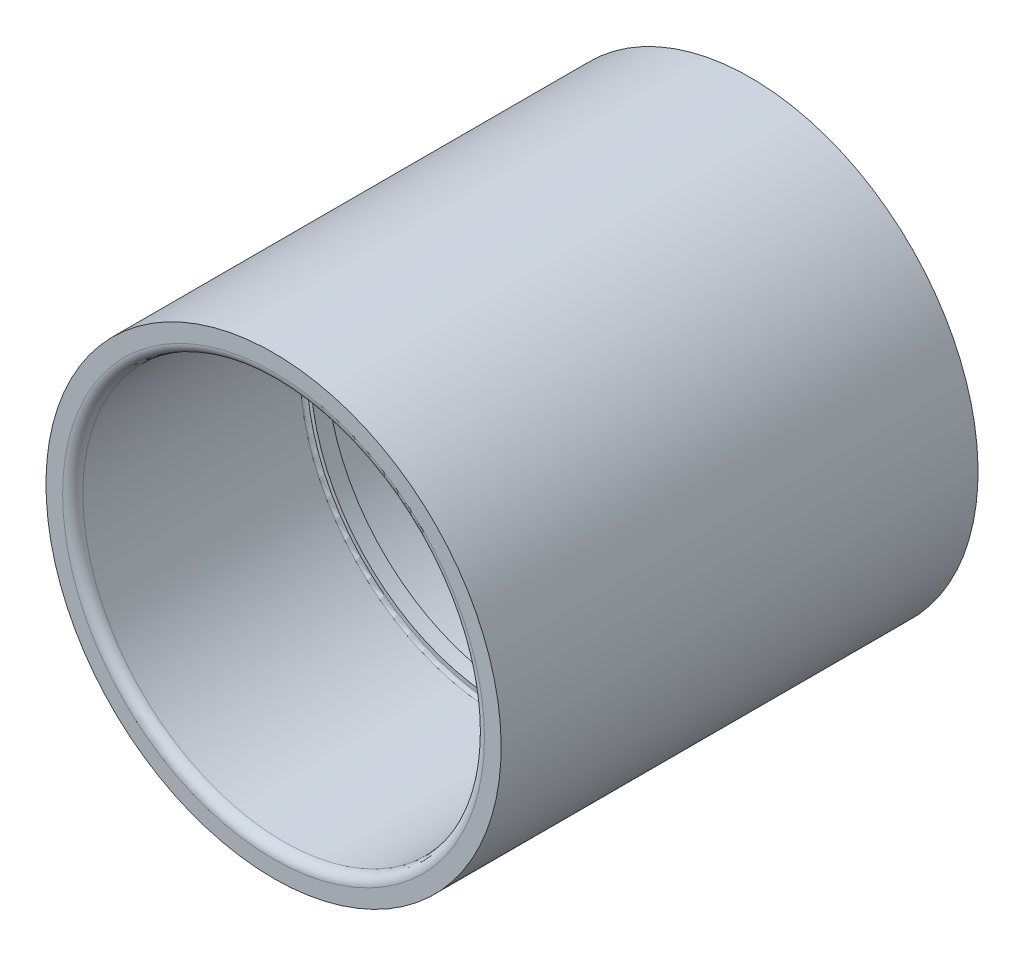
ISO-10303-21;
HEADER;
FILE_DESCRIPTION(('STEP AP214'),'2;1');
FILE_NAME('part.step','',(''),(''),'','','');
FILE_SCHEMA(('AUTOMOTIVE_DESIGN { 1 0 10303 214 1 1 1 1 }'));
ENDSEC;
DATA;
#1=APPLICATION_CONTEXT('core data for automotive mechanical design processes');
#2=APPLICATION_PROTOCOL_DEFINITION('international standard','automotive_design',2000,#1);
#3=PRODUCT_CONTEXT('',#1,'mechanical');
#4=PRODUCT('Part','Part','',(#3));
#5=PRODUCT_RELATED_PRODUCT_CATEGORY('part','',(#4));
#6=PRODUCT_DEFINITION_FORMATION('','',#4);
#7=PRODUCT_DEFINITION_CONTEXT('part definition',#1,'design');
#8=PRODUCT_DEFINITION('design','',#6,#7);
#9=PRODUCT_DEFINITION_SHAPE('','',#8);
#10=(LENGTH_UNIT() NAMED_UNIT(*) SI_UNIT(.MILLI.,.METRE.));
#11=(NAMED_UNIT(*) PLANE_ANGLE_UNIT() SI_UNIT($,.RADIAN.));
#12=(NAMED_UNIT(*) SI_UNIT($,.STERADIAN.) SOLID_ANGLE_UNIT());
#13=UNCERTAINTY_MEASURE_WITH_UNIT(LENGTH_MEASURE(1.E-05),#10,'distance_accuracy_value','');
#14=(GEOMETRIC_REPRESENTATION_CONTEXT(3) GLOBAL_UNCERTAINTY_ASSIGNED_CONTEXT((#13)) GLOBAL_UNIT_ASSIGNED_CONTEXT((#10,
#11,#12)) REPRESENTATION_CONTEXT('',''));
#15=CARTESIAN_POINT('',(0.,0.,0.));
#16=DIRECTION('',(0.,0.,1.));
#17=DIRECTION('',(1.,0.,0.));
#18=AXIS2_PLACEMENT_3D('',#15,#16,#17);
#19=CARTESIAN_POINT('',(0.,-34.3535,35.9918));
#20=DIRECTION('',(0.,0.,1.));
#21=DIRECTION('',(0.,-1.,0.));
#22=AXIS2_PLACEMENT_3D('',#19,#20,#21);
#23=PLANE('',#22);
#24=CARTESIAN_POINT('',(0.,0.,35.9918));
#25=DIRECTION('',(0.,0.,1.));
#26=DIRECTION('',(0.,-1.,0.));
#27=AXIS2_PLACEMENT_3D('',#24,#25,#26);
#28=CIRCLE('',#27,31.8389);
#29=CARTESIAN_POINT('',(0.,-31.8389,35.9918));
#30=VERTEX_POINT('',#29);
#31=EDGE_CURVE('E50',#30,#30,#28,.F.);
#32=ORIENTED_EDGE('',*,*,#31,.T.);
#33=EDGE_LOOP('',(#32));
#34=FACE_BOUND('',#33,.T.);
#35=CARTESIAN_POINT('',(0.,0.,35.9918));
#36=DIRECTION('',(0.,0.,1.));
#37=DIRECTION('',(0.,-1.,0.));
#38=AXIS2_PLACEMENT_3D('',#35,#36,#37);
#39=CIRCLE('',#38,34.3535);
#40=CARTESIAN_POINT('',(0.,-34.3535,35.9918));
#41=VERTEX_POINT('',#40);
#42=EDGE_CURVE('E71',#41,#41,#39,.T.);
#43=ORIENTED_EDGE('',*,*,#42,.T.);
#44=EDGE_LOOP('',(#43));
#45=FACE_BOUND('',#44,.T.);
#46=ADVANCED_FACE('F30',(#34,#45),#23,.T.);
#47=CARTESIAN_POINT('',(0.,0.,35.9918));
#48=DIRECTION('',(0.,0.,1.));
#49=DIRECTION('',(0.,-1.,0.));
#50=AXIS2_PLACEMENT_3D('',#47,#48,#49);
#51=CYLINDRICAL_SURFACE('',#50,30.3149);
#52=CARTESIAN_POINT('',(0.,0.,1.70180000000001));
#53=DIRECTION('',(0.,0.,1.));
#54=DIRECTION('',(0.,-1.,0.));
#55=AXIS2_PLACEMENT_3D('',#52,#53,#54);
#56=CIRCLE('',#55,30.3149);
#57=CARTESIAN_POINT('',(0.,-30.3149,1.7018));
#58=VERTEX_POINT('',#57);
#59=EDGE_CURVE('E10',#58,#58,#56,.F.);
#60=ORIENTED_EDGE('',*,*,#59,.T.);
#61=EDGE_LOOP('',(#60));
#62=FACE_BOUND('',#61,.T.);
#63=CARTESIAN_POINT('',(0.,0.,34.4678));
#64=DIRECTION('',(0.,0.,1.));
#65=DIRECTION('',(0.,-1.,0.));
#66=AXIS2_PLACEMENT_3D('',#63,#64,#65);
#67=CIRCLE('',#66,30.3149);
#68=CARTESIAN_POINT('',(0.,-30.3149,34.4678));
#69=VERTEX_POINT('',#68);
#70=EDGE_CURVE('E53',#69,#69,#67,.T.);
#71=ORIENTED_EDGE('',*,*,#70,.T.);
#72=EDGE_LOOP('',(#71));
#73=FACE_BOUND('',#72,.T.);
#74=ADVANCED_FACE('F93',(#62,#73),#51,.F.);
#75=CARTESIAN_POINT('',(0.,-30.3149,1.1938));
#76=DIRECTION('',(0.,0.,1.));
#77=DIRECTION('',(0.,-1.,0.));
#78=AXIS2_PLACEMENT_3D('',#75,#76,#77);
#79=PLANE('',#78);
#80=CARTESIAN_POINT('',(0.,0.,1.19380000000001));
#81=DIRECTION('',(0.,0.,1.));
#82=DIRECTION('',(0.,-1.,0.));
#83=AXIS2_PLACEMENT_3D('',#80,#81,#82);
#84=CIRCLE('',#83,29.8069);
#85=CARTESIAN_POINT('',(0.,-29.8069,1.1938));
#86=VERTEX_POINT('',#85);
#87=EDGE_CURVE('E37',#86,#86,#84,.T.);
#88=ORIENTED_EDGE('',*,*,#87,.T.);
#89=EDGE_LOOP('',(#88));
#90=FACE_BOUND('',#89,.T.);
#91=CARTESIAN_POINT('',(0.,0.,1.19380000000001));
#92=DIRECTION('',(0.,0.,1.));
#93=DIRECTION('',(0.,-1.,0.));
#94=AXIS2_PLACEMENT_3D('',#91,#92,#93);
#95=CIRCLE('',#94,29.1973);
#96=CARTESIAN_POINT('',(0.,-29.1973,1.1938));
#97=VERTEX_POINT('',#96);
#98=EDGE_CURVE('E62',#97,#97,#95,.T.);
#99=ORIENTED_EDGE('',*,*,#98,.F.);
#100=EDGE_LOOP('',(#99));
#101=FACE_BOUND('',#100,.T.);
#102=ADVANCED_FACE('F99',(#90,#101),#79,.T.);
#103=CARTESIAN_POINT('',(0.,0.,35.9918));
#104=DIRECTION('',(0.,0.,1.));
#105=DIRECTION('',(0.,-1.,0.));
#106=AXIS2_PLACEMENT_3D('',#103,#104,#105);
#107=CYLINDRICAL_SURFACE('',#106,29.1973);
#108=ORIENTED_EDGE('',*,*,#98,.T.);
#109=EDGE_LOOP('',(#108));
#110=FACE_BOUND('',#109,.T.);
#111=CARTESIAN_POINT('',(0.,0.,-1.19379999999999));
#112=DIRECTION('',(0.,0.,1.));
#113=DIRECTION('',(0.,-1.,0.));
#114=AXIS2_PLACEMENT_3D('',#111,#112,#113);
#115=CIRCLE('',#114,29.1973);
#116=CARTESIAN_POINT('',(0.,-29.1973,-1.1938));
#117=VERTEX_POINT('',#116);
#118=EDGE_CURVE('E65',#117,#117,#115,.T.);
#119=ORIENTED_EDGE('',*,*,#118,.F.);
#120=EDGE_LOOP('',(#119));
#121=FACE_BOUND('',#120,.T.);
#122=ADVANCED_FACE('F128',(#110,#121),#107,.F.);
#123=CARTESIAN_POINT('',(0.,-30.3149,-1.1938));
#124=DIRECTION('',(0.,0.,-1.));
#125=DIRECTION('',(0.,1.,0.));
#126=AXIS2_PLACEMENT_3D('',#123,#124,#125);
#127=PLANE('',#126);
#128=CARTESIAN_POINT('',(0.,0.,-1.19379999999999));
#129=DIRECTION('',(0.,0.,-1.));
#130=DIRECTION('',(0.,1.,0.));
#131=AXIS2_PLACEMENT_3D('',#128,#129,#130);
#132=CIRCLE('',#131,29.8069);
#133=CARTESIAN_POINT('',(0.,29.8069,-1.19379999999999));
#134=VERTEX_POINT('',#133);
#135=EDGE_CURVE('E41',#134,#134,#132,.T.);
#136=ORIENTED_EDGE('',*,*,#135,.T.);
#137=EDGE_LOOP('',(#136));
#138=FACE_BOUND('',#137,.T.);
#139=ORIENTED_EDGE('',*,*,#118,.T.);
#140=EDGE_LOOP('',(#139));
#141=FACE_BOUND('',#140,.T.);
#142=ADVANCED_FACE('F118',(#138,#141),#127,.T.);
#143=CARTESIAN_POINT('',(0.,0.,35.9918));
#144=DIRECTION('',(0.,0.,1.));
#145=DIRECTION('',(0.,-1.,0.));
#146=AXIS2_PLACEMENT_3D('',#143,#144,#145);
#147=CYLINDRICAL_SURFACE('',#146,30.3149);
#148=CARTESIAN_POINT('',(0.,0.,-1.7018));
#149=DIRECTION('',(0.,0.,-1.));
#150=DIRECTION('',(0.,1.,0.));
#151=AXIS2_PLACEMENT_3D('',#148,#149,#150);
#152=CIRCLE('',#151,30.3149);
#153=CARTESIAN_POINT('',(0.,30.3149,-1.70179999999999));
#154=VERTEX_POINT('',#153);
#155=EDGE_CURVE('E45',#154,#154,#152,.F.);
#156=ORIENTED_EDGE('',*,*,#155,.T.);
#157=EDGE_LOOP('',(#156));
#158=FACE_BOUND('',#157,.T.);
#159=CARTESIAN_POINT('',(0.,0.,-34.4678));
#160=DIRECTION('',(0.,0.,-1.));
#161=DIRECTION('',(0.,1.,0.));
#162=AXIS2_PLACEMENT_3D('',#159,#160,#161);
#163=CIRCLE('',#162,30.3149);
#164=CARTESIAN_POINT('',(0.,30.3149,-34.4678));
#165=VERTEX_POINT('',#164);
#166=EDGE_CURVE('E56',#165,#165,#163,.T.);
#167=ORIENTED_EDGE('',*,*,#166,.T.);
#168=EDGE_LOOP('',(#167));
#169=FACE_BOUND('',#168,.T.);
#170=ADVANCED_FACE('F89',(#158,#169),#147,.F.);
#171=CARTESIAN_POINT('',(0.,-34.3535,-35.9918));
#172=DIRECTION('',(0.,0.,-1.));
#173=DIRECTION('',(0.,1.,0.));
#174=AXIS2_PLACEMENT_3D('',#171,#172,#173);
#175=PLANE('',#174);
#176=CARTESIAN_POINT('',(0.,0.,-35.9918));
#177=DIRECTION('',(0.,0.,-1.));
#178=DIRECTION('',(0.,1.,0.));
#179=AXIS2_PLACEMENT_3D('',#176,#177,#178);
#180=CIRCLE('',#179,31.8389);
#181=CARTESIAN_POINT('',(0.,31.8389,-35.9918));
#182=VERTEX_POINT('',#181);
#183=EDGE_CURVE('E59',#182,#182,#180,.F.);
#184=ORIENTED_EDGE('',*,*,#183,.T.);
#185=EDGE_LOOP('',(#184));
#186=FACE_BOUND('',#185,.T.);
#187=CARTESIAN_POINT('',(0.,0.,-35.9918));
#188=DIRECTION('',(0.,0.,1.));
#189=DIRECTION('',(0.,-1.,0.));
#190=AXIS2_PLACEMENT_3D('',#187,#188,#189);
#191=CIRCLE('',#190,34.3535);
#192=CARTESIAN_POINT('',(0.,-34.3535,-35.9918));
#193=VERTEX_POINT('',#192);
#194=EDGE_CURVE('E68',#193,#193,#191,.T.);
#195=ORIENTED_EDGE('',*,*,#194,.F.);
#196=EDGE_LOOP('',(#195));
#197=FACE_BOUND('',#196,.T.);
#198=ADVANCED_FACE('F79',(#186,#197),#175,.T.);
#199=CARTESIAN_POINT('',(0.,0.,35.9918));
#200=DIRECTION('',(0.,0.,1.));
#201=DIRECTION('',(0.,-1.,0.));
#202=AXIS2_PLACEMENT_3D('',#199,#200,#201);
#203=CYLINDRICAL_SURFACE('',#202,34.3535);
#204=ORIENTED_EDGE('',*,*,#194,.T.);
#205=EDGE_LOOP('',(#204));
#206=FACE_BOUND('',#205,.T.);
#207=ORIENTED_EDGE('',*,*,#42,.F.);
#208=EDGE_LOOP('',(#207));
#209=FACE_BOUND('',#208,.T.);
#210=ADVANCED_FACE('F76',(#206,#209),#203,.T.);
#211=CARTESIAN_POINT('',(0.,0.,-34.4678));
#212=DIRECTION('',(0.,0.,-1.));
#213=DIRECTION('',(0.,1.,0.));
#214=AXIS2_PLACEMENT_3D('',#211,#212,#213);
#215=TOROIDAL_SURFACE('',#214,31.8389,1.524);
#216=ORIENTED_EDGE('',*,*,#166,.F.);
#217=EDGE_LOOP('',(#216));
#218=FACE_BOUND('',#217,.T.);
#219=ORIENTED_EDGE('',*,*,#183,.F.);
#220=EDGE_LOOP('',(#219));
#221=FACE_BOUND('',#220,.T.);
#222=ADVANCED_FACE('F78',(#218,#221),#215,.T.);
#223=CARTESIAN_POINT('',(0.,0.,34.4678));
#224=DIRECTION('',(0.,0.,1.));
#225=DIRECTION('',(0.,-1.,0.));
#226=AXIS2_PLACEMENT_3D('',#223,#224,#225);
#227=TOROIDAL_SURFACE('',#226,31.8389,1.524);
#228=ORIENTED_EDGE('',*,*,#31,.F.);
#229=EDGE_LOOP('',(#228));
#230=FACE_BOUND('',#229,.T.);
#231=ORIENTED_EDGE('',*,*,#70,.F.);
#232=EDGE_LOOP('',(#231));
#233=FACE_BOUND('',#232,.T.);
#234=ADVANCED_FACE('F86',(#230,#233),#227,.T.);
#235=CARTESIAN_POINT('',(0.,0.,-1.7018));
#236=DIRECTION('',(0.,0.,-1.));
#237=DIRECTION('',(0.,1.,0.));
#238=AXIS2_PLACEMENT_3D('',#235,#236,#237);
#239=TOROIDAL_SURFACE('',#238,29.8069,0.508);
#240=ORIENTED_EDGE('',*,*,#135,.F.);
#241=EDGE_LOOP('',(#240));
#242=FACE_BOUND('',#241,.T.);
#243=ORIENTED_EDGE('',*,*,#155,.F.);
#244=EDGE_LOOP('',(#243));
#245=FACE_BOUND('',#244,.T.);
#246=ADVANCED_FACE('F104',(#242,#245),#239,.F.);
#247=CARTESIAN_POINT('',(0.,0.,1.70180000000001));
#248=DIRECTION('',(0.,0.,1.));
#249=DIRECTION('',(0.,-1.,0.));
#250=AXIS2_PLACEMENT_3D('',#247,#248,#249);
#251=TOROIDAL_SURFACE('',#250,29.8069,0.508);
#252=ORIENTED_EDGE('',*,*,#59,.F.);
#253=EDGE_LOOP('',(#252));
#254=FACE_BOUND('',#253,.T.);
#255=ORIENTED_EDGE('',*,*,#87,.F.);
#256=EDGE_LOOP('',(#255));
#257=FACE_BOUND('',#256,.T.);
#258=ADVANCED_FACE('F32',(#254,#257),#251,.F.);
#259=CLOSED_SHELL('',(#46,#74,#102,#122,#142,#170,#198,#210,#222,#234,#246,#258));
#260=MANIFOLD_SOLID_BREP('B2',#259);
#261=ADVANCED_BREP_SHAPE_REPRESENTATION('',(#18,#260),#14);
#262=SHAPE_DEFINITION_REPRESENTATION(#9,#261);
ENDSEC;
END-ISO-10303-21;
